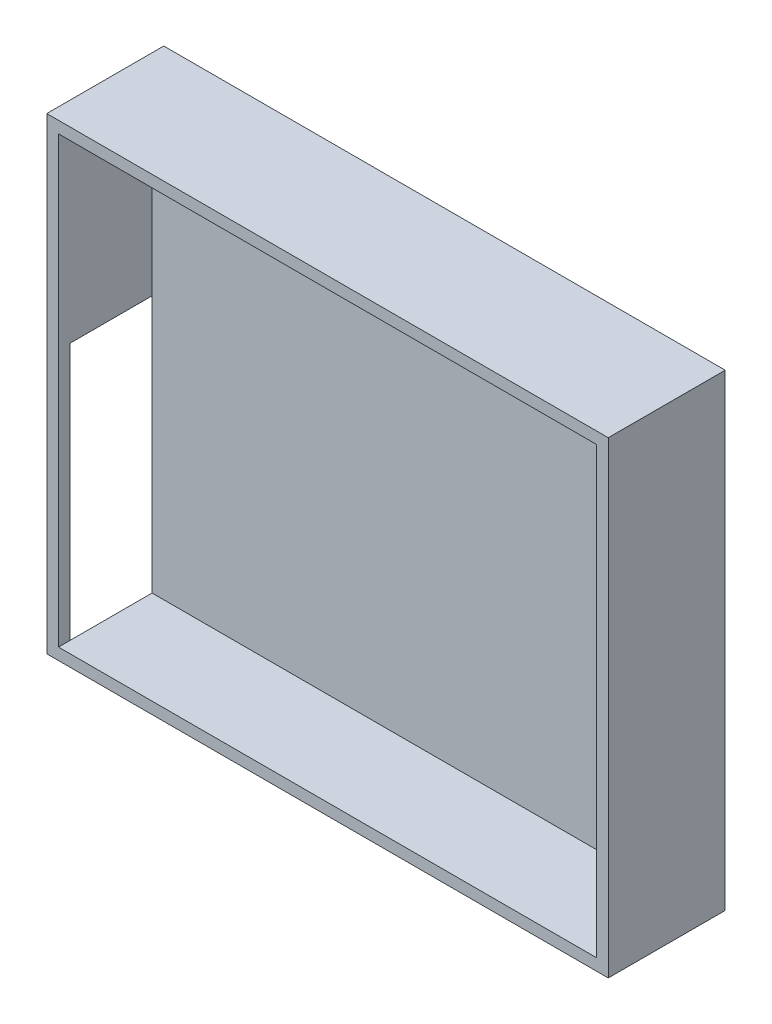
ISO-10303-21;
HEADER;
FILE_DESCRIPTION(('STEP AP214'),'2;1');
FILE_NAME('part.step','',(''),(''),'','','');
FILE_SCHEMA(('AUTOMOTIVE_DESIGN { 1 0 10303 214 1 1 1 1 }'));
ENDSEC;
DATA;
#1=APPLICATION_CONTEXT('core data for automotive mechanical design processes');
#2=APPLICATION_PROTOCOL_DEFINITION('international standard','automotive_design',2000,#1);
#3=PRODUCT_CONTEXT('',#1,'mechanical');
#4=PRODUCT('Part','Part','',(#3));
#5=PRODUCT_RELATED_PRODUCT_CATEGORY('part','',(#4));
#6=PRODUCT_DEFINITION_FORMATION('','',#4);
#7=PRODUCT_DEFINITION_CONTEXT('part definition',#1,'design');
#8=PRODUCT_DEFINITION('design','',#6,#7);
#9=PRODUCT_DEFINITION_SHAPE('','',#8);
#10=(LENGTH_UNIT() NAMED_UNIT(*) SI_UNIT(.MILLI.,.METRE.));
#11=(NAMED_UNIT(*) PLANE_ANGLE_UNIT() SI_UNIT($,.RADIAN.));
#12=(NAMED_UNIT(*) SI_UNIT($,.STERADIAN.) SOLID_ANGLE_UNIT());
#13=UNCERTAINTY_MEASURE_WITH_UNIT(LENGTH_MEASURE(1.E-05),#10,'distance_accuracy_value','');
#14=(GEOMETRIC_REPRESENTATION_CONTEXT(3) GLOBAL_UNCERTAINTY_ASSIGNED_CONTEXT((#13)) GLOBAL_UNIT_ASSIGNED_CONTEXT((#10,
#11,#12)) REPRESENTATION_CONTEXT('',''));
#15=CARTESIAN_POINT('',(0.,0.,0.));
#16=DIRECTION('',(0.,0.,1.));
#17=DIRECTION('',(1.,0.,0.));
#18=AXIS2_PLACEMENT_3D('',#15,#16,#17);
#19=CARTESIAN_POINT('',(60.,50.,25.));
#20=DIRECTION('',(-1.,0.,0.));
#21=DIRECTION('',(0.,-1.,0.));
#22=AXIS2_PLACEMENT_3D('',#19,#20,#21);
#23=PLANE('',#22);
#24=DIRECTION('',(0.,1.,0.));
#25=VECTOR('',#24,1.);
#26=CARTESIAN_POINT('',(60.,50.,0.));
#27=LINE('',#26,#25);
#28=CARTESIAN_POINT('',(60.,-50.,0.));
#29=VERTEX_POINT('',#28);
#30=CARTESIAN_POINT('',(60.,50.,0.));
#31=VERTEX_POINT('',#30);
#32=EDGE_CURVE('E223',#29,#31,#27,.T.);
#33=ORIENTED_EDGE('',*,*,#32,.T.);
#34=DIRECTION('',(0.,0.,-1.));
#35=VECTOR('',#34,1.);
#36=CARTESIAN_POINT('',(60.,50.,25.));
#37=LINE('',#36,#35);
#38=CARTESIAN_POINT('',(60.,50.,25.));
#39=VERTEX_POINT('',#38);
#40=EDGE_CURVE('E55',#39,#31,#37,.T.);
#41=ORIENTED_EDGE('',*,*,#40,.F.);
#42=DIRECTION('',(0.,1.,0.));
#43=VECTOR('',#42,1.);
#44=CARTESIAN_POINT('',(60.,50.,25.));
#45=LINE('',#44,#43);
#46=CARTESIAN_POINT('',(60.,-50.,25.));
#47=VERTEX_POINT('',#46);
#48=EDGE_CURVE('E234',#47,#39,#45,.T.);
#49=ORIENTED_EDGE('',*,*,#48,.F.);
#50=DIRECTION('',(0.,0.,-1.));
#51=VECTOR('',#50,1.);
#52=CARTESIAN_POINT('',(60.,-50.,25.));
#53=LINE('',#52,#51);
#54=EDGE_CURVE('E248',#47,#29,#53,.T.);
#55=ORIENTED_EDGE('',*,*,#54,.T.);
#56=EDGE_LOOP('',(#33,#41,#49,#55));
#57=FACE_BOUND('',#56,.T.);
#58=ADVANCED_FACE('F47',(#57),#23,.F.);
#59=CARTESIAN_POINT('',(-60.,50.,25.));
#60=DIRECTION('',(0.,-1.,0.));
#61=DIRECTION('',(0.,0.,-1.));
#62=AXIS2_PLACEMENT_3D('',#59,#60,#61);
#63=PLANE('',#62);
#64=DIRECTION('',(-1.,0.,0.));
#65=VECTOR('',#64,1.);
#66=CARTESIAN_POINT('',(-60.,50.,0.));
#67=LINE('',#66,#65);
#68=CARTESIAN_POINT('',(-60.,50.,0.));
#69=VERTEX_POINT('',#68);
#70=EDGE_CURVE('E252',#31,#69,#67,.T.);
#71=ORIENTED_EDGE('',*,*,#70,.T.);
#72=DIRECTION('',(0.,0.,-1.));
#73=VECTOR('',#72,1.);
#74=CARTESIAN_POINT('',(-60.,50.,25.));
#75=LINE('',#74,#73);
#76=CARTESIAN_POINT('',(-60.,50.,25.));
#77=VERTEX_POINT('',#76);
#78=EDGE_CURVE('E268',#77,#69,#75,.T.);
#79=ORIENTED_EDGE('',*,*,#78,.F.);
#80=DIRECTION('',(-1.,0.,0.));
#81=VECTOR('',#80,1.);
#82=CARTESIAN_POINT('',(-60.,50.,25.));
#83=LINE('',#82,#81);
#84=EDGE_CURVE('E238',#39,#77,#83,.T.);
#85=ORIENTED_EDGE('',*,*,#84,.F.);
#86=ORIENTED_EDGE('',*,*,#40,.T.);
#87=EDGE_LOOP('',(#71,#79,#85,#86));
#88=FACE_BOUND('',#87,.T.);
#89=ADVANCED_FACE('F275',(#88),#63,.F.);
#90=CARTESIAN_POINT('',(-60.,50.,25.));
#91=DIRECTION('',(1.,0.,0.));
#92=DIRECTION('',(0.,1.,0.));
#93=AXIS2_PLACEMENT_3D('',#90,#91,#92);
#94=PLANE('',#93);
#95=DIRECTION('',(0.,0.,-1.));
#96=VECTOR('',#95,1.);
#97=CARTESIAN_POINT('',(-60.,7.49999999999999,2.5));
#98=LINE('',#97,#96);
#99=CARTESIAN_POINT('',(-60.,7.49999999999999,22.5));
#100=VERTEX_POINT('',#99);
#101=CARTESIAN_POINT('',(-60.,7.49999999999999,2.5));
#102=VERTEX_POINT('',#101);
#103=EDGE_CURVE('E156',#100,#102,#98,.T.);
#104=ORIENTED_EDGE('',*,*,#103,.F.);
#105=DIRECTION('',(0.,1.,0.));
#106=VECTOR('',#105,1.);
#107=CARTESIAN_POINT('',(-60.,-52.5,22.5));
#108=LINE('',#107,#106);
#109=CARTESIAN_POINT('',(-60.,-50.,22.5));
#110=VERTEX_POINT('',#109);
#111=EDGE_CURVE('E142',#110,#100,#108,.T.);
#112=ORIENTED_EDGE('',*,*,#111,.F.);
#113=DIRECTION('',(0.,0.,-1.));
#114=VECTOR('',#113,1.);
#115=CARTESIAN_POINT('',(-60.,-50.,25.));
#116=LINE('',#115,#114);
#117=CARTESIAN_POINT('',(-60.,-50.,25.));
#118=VERTEX_POINT('',#117);
#119=EDGE_CURVE('E265',#118,#110,#116,.T.);
#120=ORIENTED_EDGE('',*,*,#119,.F.);
#121=DIRECTION('',(0.,-1.,0.));
#122=VECTOR('',#121,1.);
#123=CARTESIAN_POINT('',(-60.,50.,25.));
#124=LINE('',#123,#122);
#125=EDGE_CURVE('E242',#77,#118,#124,.T.);
#126=ORIENTED_EDGE('',*,*,#125,.F.);
#127=ORIENTED_EDGE('',*,*,#78,.T.);
#128=DIRECTION('',(0.,-1.,0.));
#129=VECTOR('',#128,1.);
#130=CARTESIAN_POINT('',(-60.,50.,0.));
#131=LINE('',#130,#129);
#132=CARTESIAN_POINT('',(-60.,-50.,0.));
#133=VERTEX_POINT('',#132);
#134=EDGE_CURVE('E255',#69,#133,#131,.T.);
#135=ORIENTED_EDGE('',*,*,#134,.T.);
#136=CARTESIAN_POINT('',(-60.,-50.,2.5));
#137=VERTEX_POINT('',#136);
#138=EDGE_CURVE('E264',#137,#133,#116,.T.);
#139=ORIENTED_EDGE('',*,*,#138,.F.);
#140=DIRECTION('',(0.,-1.,0.));
#141=VECTOR('',#140,1.);
#142=CARTESIAN_POINT('',(-60.,-52.5,2.5));
#143=LINE('',#142,#141);
#144=EDGE_CURVE('E168',#102,#137,#143,.T.);
#145=ORIENTED_EDGE('',*,*,#144,.F.);
#146=EDGE_LOOP('',(#104,#112,#120,#126,#127,#135,#139,#145));
#147=FACE_BOUND('',#146,.T.);
#148=ADVANCED_FACE('F170',(#147),#94,.F.);
#149=CARTESIAN_POINT('',(-60.,-50.,25.));
#150=DIRECTION('',(0.,1.,0.));
#151=DIRECTION('',(0.,0.,1.));
#152=AXIS2_PLACEMENT_3D('',#149,#150,#151);
#153=PLANE('',#152);
#154=ORIENTED_EDGE('',*,*,#119,.T.);
#155=DIRECTION('',(1.,0.,0.));
#156=VECTOR('',#155,1.);
#157=CARTESIAN_POINT('',(-60.,-50.,22.5));
#158=LINE('',#157,#156);
#159=CARTESIAN_POINT('',(-57.5,-50.,22.5));
#160=VERTEX_POINT('',#159);
#161=EDGE_CURVE('E150',#110,#160,#158,.T.);
#162=ORIENTED_EDGE('',*,*,#161,.T.);
#163=DIRECTION('',(0.,0.,1.));
#164=VECTOR('',#163,1.);
#165=CARTESIAN_POINT('',(-57.5,-50.,25.));
#166=LINE('',#165,#164);
#167=CARTESIAN_POINT('',(-57.5,-50.,2.5));
#168=VERTEX_POINT('',#167);
#169=EDGE_CURVE('E183',#168,#160,#166,.T.);
#170=ORIENTED_EDGE('',*,*,#169,.F.);
#171=DIRECTION('',(-1.,0.,0.));
#172=VECTOR('',#171,1.);
#173=CARTESIAN_POINT('',(-60.,-50.,2.5));
#174=LINE('',#173,#172);
#175=EDGE_CURVE('E11',#168,#137,#174,.T.);
#176=ORIENTED_EDGE('',*,*,#175,.T.);
#177=ORIENTED_EDGE('',*,*,#138,.T.);
#178=DIRECTION('',(1.,0.,0.));
#179=VECTOR('',#178,1.);
#180=CARTESIAN_POINT('',(-60.,-50.,0.));
#181=LINE('',#180,#179);
#182=EDGE_CURVE('E239',#133,#29,#181,.T.);
#183=ORIENTED_EDGE('',*,*,#182,.T.);
#184=ORIENTED_EDGE('',*,*,#54,.F.);
#185=DIRECTION('',(1.,0.,0.));
#186=VECTOR('',#185,1.);
#187=CARTESIAN_POINT('',(-60.,-50.,25.));
#188=LINE('',#187,#186);
#189=EDGE_CURVE('E245',#118,#47,#188,.T.);
#190=ORIENTED_EDGE('',*,*,#189,.F.);
#191=EDGE_LOOP('',(#154,#162,#170,#176,#177,#183,#184,#190));
#192=FACE_BOUND('',#191,.T.);
#193=ADVANCED_FACE('F290',(#192),#153,.F.);
#194=CARTESIAN_POINT('',(0.,0.,25.));
#195=DIRECTION('',(0.,0.,1.));
#196=DIRECTION('',(1.,0.,0.));
#197=AXIS2_PLACEMENT_3D('',#194,#195,#196);
#198=PLANE('',#197);
#199=DIRECTION('',(0.,1.,0.));
#200=VECTOR('',#199,1.);
#201=CARTESIAN_POINT('',(57.5,-47.5,25.));
#202=LINE('',#201,#200);
#203=CARTESIAN_POINT('',(57.5,-47.5,25.));
#204=VERTEX_POINT('',#203);
#205=CARTESIAN_POINT('',(57.5,47.5,25.));
#206=VERTEX_POINT('',#205);
#207=EDGE_CURVE('E70',#204,#206,#202,.T.);
#208=ORIENTED_EDGE('',*,*,#207,.F.);
#209=DIRECTION('',(1.,0.,0.));
#210=VECTOR('',#209,1.);
#211=CARTESIAN_POINT('',(-57.5,-47.5,25.));
#212=LINE('',#211,#210);
#213=CARTESIAN_POINT('',(-57.5,-47.5,25.));
#214=VERTEX_POINT('',#213);
#215=EDGE_CURVE('E193',#214,#204,#212,.T.);
#216=ORIENTED_EDGE('',*,*,#215,.F.);
#217=DIRECTION('',(0.,-1.,0.));
#218=VECTOR('',#217,1.);
#219=CARTESIAN_POINT('',(-57.5,-47.5,25.));
#220=LINE('',#219,#218);
#221=CARTESIAN_POINT('',(-57.5,47.5,25.));
#222=VERTEX_POINT('',#221);
#223=EDGE_CURVE('E213',#222,#214,#220,.T.);
#224=ORIENTED_EDGE('',*,*,#223,.F.);
#225=DIRECTION('',(-1.,0.,0.));
#226=VECTOR('',#225,1.);
#227=CARTESIAN_POINT('',(-57.5,47.5,25.));
#228=LINE('',#227,#226);
#229=EDGE_CURVE('E209',#206,#222,#228,.T.);
#230=ORIENTED_EDGE('',*,*,#229,.F.);
#231=EDGE_LOOP('',(#208,#216,#224,#230));
#232=FACE_BOUND('',#231,.T.);
#233=ORIENTED_EDGE('',*,*,#48,.T.);
#234=ORIENTED_EDGE('',*,*,#84,.T.);
#235=ORIENTED_EDGE('',*,*,#125,.T.);
#236=ORIENTED_EDGE('',*,*,#189,.T.);
#237=EDGE_LOOP('',(#233,#234,#235,#236));
#238=FACE_BOUND('',#237,.T.);
#239=ADVANCED_FACE('F288',(#232,#238),#198,.T.);
#240=CARTESIAN_POINT('',(0.,0.,0.));
#241=DIRECTION('',(0.,0.,1.));
#242=DIRECTION('',(1.,0.,0.));
#243=AXIS2_PLACEMENT_3D('',#240,#241,#242);
#244=PLANE('',#243);
#245=ORIENTED_EDGE('',*,*,#32,.F.);
#246=ORIENTED_EDGE('',*,*,#182,.F.);
#247=ORIENTED_EDGE('',*,*,#134,.F.);
#248=ORIENTED_EDGE('',*,*,#70,.F.);
#249=EDGE_LOOP('',(#245,#246,#247,#248));
#250=FACE_BOUND('',#249,.T.);
#251=ADVANCED_FACE('F283',(#250),#244,.F.);
#252=CARTESIAN_POINT('',(57.5,-47.5,5.));
#253=DIRECTION('',(1.,0.,0.));
#254=DIRECTION('',(0.,0.,-1.));
#255=AXIS2_PLACEMENT_3D('',#252,#253,#254);
#256=PLANE('',#255);
#257=ORIENTED_EDGE('',*,*,#207,.T.);
#258=DIRECTION('',(0.,0.,1.));
#259=VECTOR('',#258,1.);
#260=CARTESIAN_POINT('',(57.5,47.5,5.));
#261=LINE('',#260,#259);
#262=CARTESIAN_POINT('',(57.5,47.5,5.));
#263=VERTEX_POINT('',#262);
#264=EDGE_CURVE('E206',#263,#206,#261,.T.);
#265=ORIENTED_EDGE('',*,*,#264,.F.);
#266=DIRECTION('',(0.,1.,0.));
#267=VECTOR('',#266,1.);
#268=CARTESIAN_POINT('',(57.5,-47.5,5.));
#269=LINE('',#268,#267);
#270=CARTESIAN_POINT('',(57.5,-47.5,5.));
#271=VERTEX_POINT('',#270);
#272=EDGE_CURVE('E188',#271,#263,#269,.T.);
#273=ORIENTED_EDGE('',*,*,#272,.F.);
#274=DIRECTION('',(0.,0.,1.));
#275=VECTOR('',#274,1.);
#276=CARTESIAN_POINT('',(57.5,-47.5,5.));
#277=LINE('',#276,#275);
#278=EDGE_CURVE('E220',#271,#204,#277,.T.);
#279=ORIENTED_EDGE('',*,*,#278,.T.);
#280=EDGE_LOOP('',(#257,#265,#273,#279));
#281=FACE_BOUND('',#280,.T.);
#282=ADVANCED_FACE('F314',(#281),#256,.F.);
#283=CARTESIAN_POINT('',(-57.5,-47.5,5.));
#284=DIRECTION('',(0.,-1.,0.));
#285=DIRECTION('',(0.,0.,-1.));
#286=AXIS2_PLACEMENT_3D('',#283,#284,#285);
#287=PLANE('',#286);
#288=ORIENTED_EDGE('',*,*,#215,.T.);
#289=ORIENTED_EDGE('',*,*,#278,.F.);
#290=DIRECTION('',(1.,0.,0.));
#291=VECTOR('',#290,1.);
#292=CARTESIAN_POINT('',(-57.5,-47.5,5.));
#293=LINE('',#292,#291);
#294=CARTESIAN_POINT('',(-57.5,-47.5,5.));
#295=VERTEX_POINT('',#294);
#296=EDGE_CURVE('E202',#295,#271,#293,.T.);
#297=ORIENTED_EDGE('',*,*,#296,.F.);
#298=DIRECTION('',(0.,0.,1.));
#299=VECTOR('',#298,1.);
#300=CARTESIAN_POINT('',(-57.5,-47.5,5.));
#301=LINE('',#300,#299);
#302=CARTESIAN_POINT('',(-57.5,-47.5,22.5));
#303=VERTEX_POINT('',#302);
#304=EDGE_CURVE('E224',#295,#303,#301,.T.);
#305=ORIENTED_EDGE('',*,*,#304,.T.);
#306=EDGE_CURVE('E228',#303,#214,#301,.T.);
#307=ORIENTED_EDGE('',*,*,#306,.T.);
#308=EDGE_LOOP('',(#288,#289,#297,#305,#307));
#309=FACE_BOUND('',#308,.T.);
#310=ADVANCED_FACE('F311',(#309),#287,.F.);
#311=CARTESIAN_POINT('',(-57.5,-47.5,5.));
#312=DIRECTION('',(-1.,0.,0.));
#313=DIRECTION('',(0.,0.,1.));
#314=AXIS2_PLACEMENT_3D('',#311,#312,#313);
#315=PLANE('',#314);
#316=ORIENTED_EDGE('',*,*,#306,.F.);
#317=DIRECTION('',(0.,-1.,0.));
#318=VECTOR('',#317,1.);
#319=CARTESIAN_POINT('',(-57.5,-52.5,22.5));
#320=LINE('',#319,#318);
#321=CARTESIAN_POINT('',(-57.5,7.49999999999999,22.5));
#322=VERTEX_POINT('',#321);
#323=EDGE_CURVE('E298',#322,#303,#320,.T.);
#324=ORIENTED_EDGE('',*,*,#323,.F.);
#325=DIRECTION('',(0.,0.,1.));
#326=VECTOR('',#325,1.);
#327=CARTESIAN_POINT('',(-57.5,7.49999999999999,2.5));
#328=LINE('',#327,#326);
#329=CARTESIAN_POINT('',(-57.5,7.49999999999999,5.));
#330=VERTEX_POINT('',#329);
#331=EDGE_CURVE('E165',#330,#322,#328,.T.);
#332=ORIENTED_EDGE('',*,*,#331,.F.);
#333=DIRECTION('',(0.,-1.,0.));
#334=VECTOR('',#333,1.);
#335=CARTESIAN_POINT('',(-57.5,-47.5,5.));
#336=LINE('',#335,#334);
#337=CARTESIAN_POINT('',(-57.5,47.5,5.));
#338=VERTEX_POINT('',#337);
#339=EDGE_CURVE('E198',#338,#330,#336,.T.);
#340=ORIENTED_EDGE('',*,*,#339,.F.);
#341=DIRECTION('',(0.,0.,1.));
#342=VECTOR('',#341,1.);
#343=CARTESIAN_POINT('',(-57.5,47.5,5.));
#344=LINE('',#343,#342);
#345=EDGE_CURVE('E229',#338,#222,#344,.T.);
#346=ORIENTED_EDGE('',*,*,#345,.T.);
#347=ORIENTED_EDGE('',*,*,#223,.T.);
#348=EDGE_LOOP('',(#316,#324,#332,#340,#346,#347));
#349=FACE_BOUND('',#348,.T.);
#350=ADVANCED_FACE('F322',(#349),#315,.F.);
#351=CARTESIAN_POINT('',(-57.5,47.5,5.));
#352=DIRECTION('',(0.,1.,0.));
#353=DIRECTION('',(0.,0.,1.));
#354=AXIS2_PLACEMENT_3D('',#351,#352,#353);
#355=PLANE('',#354);
#356=ORIENTED_EDGE('',*,*,#229,.T.);
#357=ORIENTED_EDGE('',*,*,#345,.F.);
#358=DIRECTION('',(-1.,0.,0.));
#359=VECTOR('',#358,1.);
#360=CARTESIAN_POINT('',(-57.5,47.5,5.));
#361=LINE('',#360,#359);
#362=EDGE_CURVE('E192',#263,#338,#361,.T.);
#363=ORIENTED_EDGE('',*,*,#362,.F.);
#364=ORIENTED_EDGE('',*,*,#264,.T.);
#365=EDGE_LOOP('',(#356,#357,#363,#364));
#366=FACE_BOUND('',#365,.T.);
#367=ADVANCED_FACE('F317',(#366),#355,.F.);
#368=CARTESIAN_POINT('',(0.,0.,5.));
#369=DIRECTION('',(0.,0.,-1.));
#370=DIRECTION('',(-1.,0.,0.));
#371=AXIS2_PLACEMENT_3D('',#368,#369,#370);
#372=PLANE('',#371);
#373=ORIENTED_EDGE('',*,*,#272,.T.);
#374=ORIENTED_EDGE('',*,*,#362,.T.);
#375=ORIENTED_EDGE('',*,*,#339,.T.);
#376=EDGE_CURVE('E197',#330,#295,#336,.T.);
#377=ORIENTED_EDGE('',*,*,#376,.T.);
#378=ORIENTED_EDGE('',*,*,#296,.T.);
#379=EDGE_LOOP('',(#373,#374,#375,#377,#378));
#380=FACE_BOUND('',#379,.T.);
#381=ADVANCED_FACE('F308',(#380),#372,.F.);
#382=CARTESIAN_POINT('',(5.74555320336761,-52.5,2.5));
#383=DIRECTION('',(0.,0.,-1.));
#384=DIRECTION('',(-1.,0.,0.));
#385=AXIS2_PLACEMENT_3D('',#382,#383,#384);
#386=PLANE('',#385);
#387=DIRECTION('',(0.,1.,0.));
#388=VECTOR('',#387,1.);
#389=CARTESIAN_POINT('',(-57.5,-52.5,2.5));
#390=LINE('',#389,#388);
#391=CARTESIAN_POINT('',(-57.5,7.49999999999999,2.5));
#392=VERTEX_POINT('',#391);
#393=EDGE_CURVE('E62',#168,#392,#390,.T.);
#394=ORIENTED_EDGE('',*,*,#393,.T.);
#395=DIRECTION('',(-1.,0.,0.));
#396=VECTOR('',#395,1.);
#397=CARTESIAN_POINT('',(5.7455532033676,7.5,2.5));
#398=LINE('',#397,#396);
#399=EDGE_CURVE('E167',#392,#102,#398,.T.);
#400=ORIENTED_EDGE('',*,*,#399,.T.);
#401=ORIENTED_EDGE('',*,*,#144,.T.);
#402=ORIENTED_EDGE('',*,*,#175,.F.);
#403=EDGE_LOOP('',(#394,#400,#401,#402));
#404=FACE_BOUND('',#403,.T.);
#405=ADVANCED_FACE('F304',(#404),#386,.F.);
#406=CARTESIAN_POINT('',(5.74555320336761,-52.5,22.5));
#407=DIRECTION('',(0.,0.,1.));
#408=DIRECTION('',(1.,0.,0.));
#409=AXIS2_PLACEMENT_3D('',#406,#407,#408);
#410=PLANE('',#409);
#411=ORIENTED_EDGE('',*,*,#111,.T.);
#412=DIRECTION('',(-1.,0.,0.));
#413=VECTOR('',#412,1.);
#414=CARTESIAN_POINT('',(5.7455532033676,7.5,22.5));
#415=LINE('',#414,#413);
#416=EDGE_CURVE('E146',#322,#100,#415,.T.);
#417=ORIENTED_EDGE('',*,*,#416,.F.);
#418=ORIENTED_EDGE('',*,*,#323,.T.);
#419=EDGE_CURVE('E300',#303,#160,#320,.T.);
#420=ORIENTED_EDGE('',*,*,#419,.T.);
#421=ORIENTED_EDGE('',*,*,#161,.F.);
#422=EDGE_LOOP('',(#411,#417,#418,#420,#421));
#423=FACE_BOUND('',#422,.T.);
#424=ADVANCED_FACE('F144',(#423),#410,.F.);
#425=CARTESIAN_POINT('',(-57.5,-47.5,5.));
#426=DIRECTION('',(-1.,0.,0.));
#427=DIRECTION('',(0.,0.,1.));
#428=AXIS2_PLACEMENT_3D('',#425,#426,#427);
#429=PLANE('',#428);
#430=ORIENTED_EDGE('',*,*,#169,.T.);
#431=ORIENTED_EDGE('',*,*,#419,.F.);
#432=ORIENTED_EDGE('',*,*,#304,.F.);
#433=ORIENTED_EDGE('',*,*,#376,.F.);
#434=EDGE_CURVE('E180',#392,#330,#328,.T.);
#435=ORIENTED_EDGE('',*,*,#434,.F.);
#436=ORIENTED_EDGE('',*,*,#393,.F.);
#437=EDGE_LOOP('',(#430,#431,#432,#433,#435,#436));
#438=FACE_BOUND('',#437,.T.);
#439=ADVANCED_FACE('F305',(#438),#429,.T.);
#440=CARTESIAN_POINT('',(5.7455532033676,7.5,2.5));
#441=DIRECTION('',(0.,1.,0.));
#442=DIRECTION('',(-1.,0.,0.));
#443=AXIS2_PLACEMENT_3D('',#440,#441,#442);
#444=PLANE('',#443);
#445=ORIENTED_EDGE('',*,*,#434,.T.);
#446=ORIENTED_EDGE('',*,*,#331,.T.);
#447=ORIENTED_EDGE('',*,*,#416,.T.);
#448=ORIENTED_EDGE('',*,*,#103,.T.);
#449=ORIENTED_EDGE('',*,*,#399,.F.);
#450=EDGE_LOOP('',(#445,#446,#447,#448,#449));
#451=FACE_BOUND('',#450,.T.);
#452=ADVANCED_FACE('F161',(#451),#444,.F.);
#453=CLOSED_SHELL('',(#58,#89,#148,#193,#239,#251,#282,#310,#350,#367,#381,#405,#424,#439,#452));
#454=MANIFOLD_SOLID_BREP('B2',#453);
#455=ADVANCED_BREP_SHAPE_REPRESENTATION('',(#18,#454),#14);
#456=SHAPE_DEFINITION_REPRESENTATION(#9,#455);
ENDSEC;
END-ISO-10303-21;
